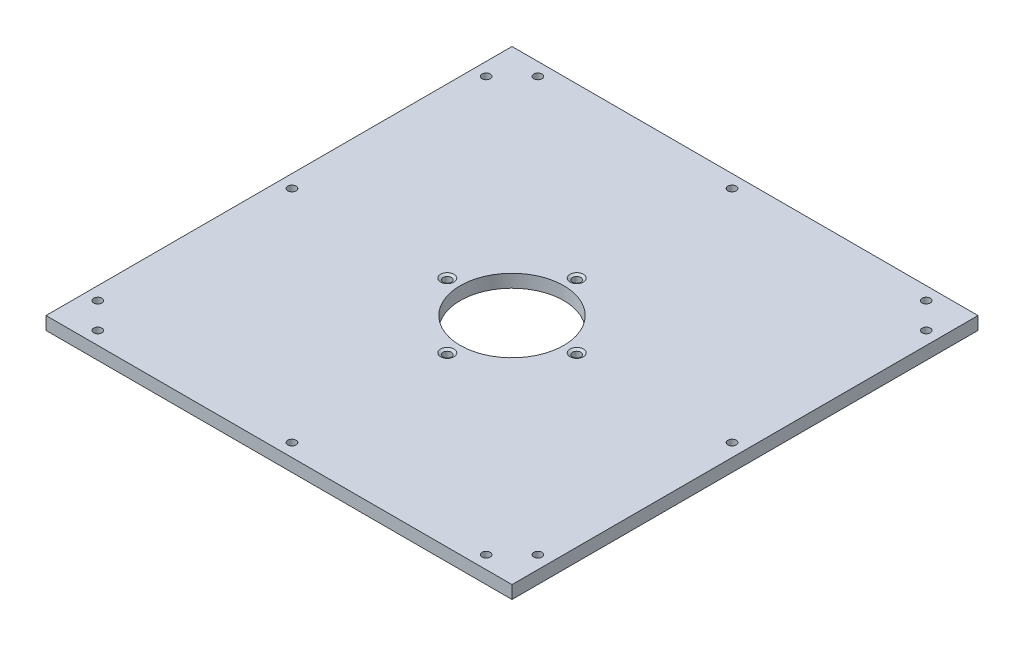
ISO-10303-21;
HEADER;
FILE_DESCRIPTION(('STEP AP214'),'2;1');
FILE_NAME('part.step','',(''),(''),'','','');
FILE_SCHEMA(('AUTOMOTIVE_DESIGN { 1 0 10303 214 1 1 1 1 }'));
ENDSEC;
DATA;
#1=APPLICATION_CONTEXT('core data for automotive mechanical design processes');
#2=APPLICATION_PROTOCOL_DEFINITION('international standard','automotive_design',2000,#1);
#3=PRODUCT_CONTEXT('',#1,'mechanical');
#4=PRODUCT('Part','Part','',(#3));
#5=PRODUCT_RELATED_PRODUCT_CATEGORY('part','',(#4));
#6=PRODUCT_DEFINITION_FORMATION('','',#4);
#7=PRODUCT_DEFINITION_CONTEXT('part definition',#1,'design');
#8=PRODUCT_DEFINITION('design','',#6,#7);
#9=PRODUCT_DEFINITION_SHAPE('','',#8);
#10=(LENGTH_UNIT() NAMED_UNIT(*) SI_UNIT(.MILLI.,.METRE.));
#11=(NAMED_UNIT(*) PLANE_ANGLE_UNIT() SI_UNIT($,.RADIAN.));
#12=(NAMED_UNIT(*) SI_UNIT($,.STERADIAN.) SOLID_ANGLE_UNIT());
#13=UNCERTAINTY_MEASURE_WITH_UNIT(LENGTH_MEASURE(1.E-05),#10,'distance_accuracy_value','');
#14=(GEOMETRIC_REPRESENTATION_CONTEXT(3) GLOBAL_UNCERTAINTY_ASSIGNED_CONTEXT((#13)) GLOBAL_UNIT_ASSIGNED_CONTEXT((#10,
#11,#12)) REPRESENTATION_CONTEXT('',''));
#15=CARTESIAN_POINT('',(0.,0.,0.));
#16=DIRECTION('',(0.,0.,1.));
#17=DIRECTION('',(1.,0.,0.));
#18=AXIS2_PLACEMENT_3D('',#15,#16,#17);
#19=CARTESIAN_POINT('',(0.,5.,0.));
#20=DIRECTION('',(0.,-1.,0.));
#21=DIRECTION('',(0.,0.,-1.));
#22=AXIS2_PLACEMENT_3D('',#19,#20,#21);
#23=PLANE('',#22);
#24=CARTESIAN_POINT('',(89.9999999999999,5.,-65.));
#25=DIRECTION('',(0.,-1.,0.));
#26=DIRECTION('',(0.,0.,-1.));
#27=AXIS2_PLACEMENT_3D('',#24,#25,#26);
#28=CIRCLE('',#27,2.60000000000007);
#29=CARTESIAN_POINT('',(89.9999999999999,5.,-67.6));
#30=VERTEX_POINT('',#29);
#31=EDGE_CURVE('E135',#30,#30,#28,.T.);
#32=ORIENTED_EDGE('',*,*,#31,.T.);
#33=EDGE_LOOP('',(#32));
#34=FACE_BOUND('',#33,.T.);
#35=CARTESIAN_POINT('',(115.,5.,-90.0000000000001));
#36=DIRECTION('',(0.,-1.,0.));
#37=DIRECTION('',(0.,0.,-1.));
#38=AXIS2_PLACEMENT_3D('',#35,#36,#37);
#39=CIRCLE('',#38,2.60000000000002);
#40=CARTESIAN_POINT('',(115.,5.,-92.6000000000001));
#41=VERTEX_POINT('',#40);
#42=EDGE_CURVE('E129',#41,#41,#39,.T.);
#43=ORIENTED_EDGE('',*,*,#42,.T.);
#44=EDGE_LOOP('',(#43));
#45=FACE_BOUND('',#44,.T.);
#46=CARTESIAN_POINT('',(64.9999999999999,5.,-90.));
#47=DIRECTION('',(0.,-1.,0.));
#48=DIRECTION('',(0.,0.,-1.));
#49=AXIS2_PLACEMENT_3D('',#46,#47,#48);
#50=CIRCLE('',#49,2.60000000000007);
#51=CARTESIAN_POINT('',(64.9999999999999,5.,-92.6));
#52=VERTEX_POINT('',#51);
#53=EDGE_CURVE('E127',#52,#52,#50,.T.);
#54=ORIENTED_EDGE('',*,*,#53,.T.);
#55=EDGE_LOOP('',(#54));
#56=FACE_BOUND('',#55,.T.);
#57=CARTESIAN_POINT('',(89.9999999999999,5.,-115.));
#58=DIRECTION('',(0.,-1.,0.));
#59=DIRECTION('',(0.,0.,-1.));
#60=AXIS2_PLACEMENT_3D('',#57,#58,#59);
#61=CIRCLE('',#60,2.60000000000007);
#62=CARTESIAN_POINT('',(89.9999999999999,5.,-117.6));
#63=VERTEX_POINT('',#62);
#64=EDGE_CURVE('E122',#63,#63,#61,.T.);
#65=ORIENTED_EDGE('',*,*,#64,.T.);
#66=EDGE_LOOP('',(#65));
#67=FACE_BOUND('',#66,.T.);
#68=DIRECTION('',(0.,0.,1.));
#69=VECTOR('',#68,1.);
#70=CARTESIAN_POINT('',(0.,5.,0.));
#71=LINE('',#70,#69);
#72=CARTESIAN_POINT('',(0.,5.,-180.));
#73=VERTEX_POINT('',#72);
#74=CARTESIAN_POINT('',(0.,5.,0.));
#75=VERTEX_POINT('',#74);
#76=EDGE_CURVE('E92',#73,#75,#71,.T.);
#77=ORIENTED_EDGE('',*,*,#76,.T.);
#78=DIRECTION('',(1.,0.,0.));
#79=VECTOR('',#78,1.);
#80=CARTESIAN_POINT('',(0.,5.,0.));
#81=LINE('',#80,#79);
#82=CARTESIAN_POINT('',(180.,5.,0.));
#83=VERTEX_POINT('',#82);
#84=EDGE_CURVE('E89',#75,#83,#81,.T.);
#85=ORIENTED_EDGE('',*,*,#84,.T.);
#86=DIRECTION('',(0.,0.,-1.));
#87=VECTOR('',#86,1.);
#88=CARTESIAN_POINT('',(180.,5.,0.));
#89=LINE('',#88,#87);
#90=CARTESIAN_POINT('',(180.,5.,-180.));
#91=VERTEX_POINT('',#90);
#92=EDGE_CURVE('E91',#83,#91,#89,.T.);
#93=ORIENTED_EDGE('',*,*,#92,.T.);
#94=DIRECTION('',(-1.,0.,0.));
#95=VECTOR('',#94,1.);
#96=CARTESIAN_POINT('',(0.,5.,-180.));
#97=LINE('',#96,#95);
#98=EDGE_CURVE('E56',#91,#73,#97,.T.);
#99=ORIENTED_EDGE('',*,*,#98,.T.);
#100=EDGE_LOOP('',(#77,#85,#93,#99));
#101=FACE_BOUND('',#100,.T.);
#102=CARTESIAN_POINT('',(89.9999999999999,5.,-90.));
#103=DIRECTION('',(0.,1.,0.));
#104=DIRECTION('',(0.,0.,1.));
#105=AXIS2_PLACEMENT_3D('',#102,#103,#104);
#106=CIRCLE('',#105,20.);
#107=CARTESIAN_POINT('',(89.9999999999999,5.,-70.));
#108=VERTEX_POINT('',#107);
#109=EDGE_CURVE('E114',#108,#108,#106,.T.);
#110=ORIENTED_EDGE('',*,*,#109,.F.);
#111=EDGE_LOOP('',(#110));
#112=FACE_BOUND('',#111,.T.);
#113=CARTESIAN_POINT('',(175.,5.,-15.0000000000001));
#114=DIRECTION('',(0.,1.,0.));
#115=DIRECTION('',(0.,0.,1.));
#116=AXIS2_PLACEMENT_3D('',#113,#114,#115);
#117=CIRCLE('',#116,1.59999999999999);
#118=CARTESIAN_POINT('',(175.,5.,-13.4000000000001));
#119=VERTEX_POINT('',#118);
#120=EDGE_CURVE('E288',#119,#119,#117,.T.);
#121=ORIENTED_EDGE('',*,*,#120,.F.);
#122=EDGE_LOOP('',(#121));
#123=FACE_BOUND('',#122,.T.);
#124=CARTESIAN_POINT('',(5.,5.,-165.));
#125=DIRECTION('',(0.,1.,0.));
#126=DIRECTION('',(0.,0.,1.));
#127=AXIS2_PLACEMENT_3D('',#124,#125,#126);
#128=CIRCLE('',#127,1.59999999999999);
#129=CARTESIAN_POINT('',(5.,5.,-163.4));
#130=VERTEX_POINT('',#129);
#131=EDGE_CURVE('E286',#130,#130,#128,.T.);
#132=ORIENTED_EDGE('',*,*,#131,.F.);
#133=EDGE_LOOP('',(#132));
#134=FACE_BOUND('',#133,.T.);
#135=CARTESIAN_POINT('',(5.00000000000002,5.,-90.));
#136=DIRECTION('',(0.,1.,0.));
#137=DIRECTION('',(0.,0.,1.));
#138=AXIS2_PLACEMENT_3D('',#135,#136,#137);
#139=CIRCLE('',#138,1.6);
#140=CARTESIAN_POINT('',(5.00000000000002,5.,-88.4));
#141=VERTEX_POINT('',#140);
#142=EDGE_CURVE('E281',#141,#141,#139,.T.);
#143=ORIENTED_EDGE('',*,*,#142,.F.);
#144=EDGE_LOOP('',(#143));
#145=FACE_BOUND('',#144,.T.);
#146=CARTESIAN_POINT('',(15.,5.,-175.));
#147=DIRECTION('',(0.,1.,0.));
#148=DIRECTION('',(0.,0.,1.));
#149=AXIS2_PLACEMENT_3D('',#146,#147,#148);
#150=CIRCLE('',#149,1.6);
#151=CARTESIAN_POINT('',(15.,5.,-173.4));
#152=VERTEX_POINT('',#151);
#153=EDGE_CURVE('E278',#152,#152,#150,.T.);
#154=ORIENTED_EDGE('',*,*,#153,.F.);
#155=EDGE_LOOP('',(#154));
#156=FACE_BOUND('',#155,.T.);
#157=CARTESIAN_POINT('',(5.,5.,-14.9999999999999));
#158=DIRECTION('',(0.,1.,0.));
#159=DIRECTION('',(0.,0.,-1.));
#160=AXIS2_PLACEMENT_3D('',#157,#158,#159);
#161=CIRCLE('',#160,1.59999999999999);
#162=CARTESIAN_POINT('',(5.,5.,-16.5999999999999));
#163=VERTEX_POINT('',#162);
#164=EDGE_CURVE('E280',#163,#163,#161,.T.);
#165=ORIENTED_EDGE('',*,*,#164,.F.);
#166=EDGE_LOOP('',(#165));
#167=FACE_BOUND('',#166,.T.);
#168=CARTESIAN_POINT('',(175.,5.,-90.0000000000001));
#169=DIRECTION('',(0.,1.,0.));
#170=DIRECTION('',(0.,0.,-1.));
#171=AXIS2_PLACEMENT_3D('',#168,#169,#170);
#172=CIRCLE('',#171,1.60000000000002);
#173=CARTESIAN_POINT('',(175.,5.,-91.6000000000002));
#174=VERTEX_POINT('',#173);
#175=EDGE_CURVE('E273',#174,#174,#172,.T.);
#176=ORIENTED_EDGE('',*,*,#175,.F.);
#177=EDGE_LOOP('',(#176));
#178=FACE_BOUND('',#177,.T.);
#179=CARTESIAN_POINT('',(175.,5.,-165.));
#180=DIRECTION('',(0.,1.,0.));
#181=DIRECTION('',(0.,0.,-1.));
#182=AXIS2_PLACEMENT_3D('',#179,#180,#181);
#183=CIRCLE('',#182,1.59999999999999);
#184=CARTESIAN_POINT('',(175.,5.,-166.6));
#185=VERTEX_POINT('',#184);
#186=EDGE_CURVE('E271',#185,#185,#183,.T.);
#187=ORIENTED_EDGE('',*,*,#186,.F.);
#188=EDGE_LOOP('',(#187));
#189=FACE_BOUND('',#188,.T.);
#190=CARTESIAN_POINT('',(89.9999999999999,5.,-175.));
#191=DIRECTION('',(0.,1.,0.));
#192=DIRECTION('',(0.,0.,1.));
#193=AXIS2_PLACEMENT_3D('',#190,#191,#192);
#194=CIRCLE('',#193,1.6);
#195=CARTESIAN_POINT('',(89.9999999999999,5.,-173.4));
#196=VERTEX_POINT('',#195);
#197=EDGE_CURVE('E268',#196,#196,#194,.T.);
#198=ORIENTED_EDGE('',*,*,#197,.F.);
#199=EDGE_LOOP('',(#198));
#200=FACE_BOUND('',#199,.T.);
#201=CARTESIAN_POINT('',(165.,5.,-175.));
#202=DIRECTION('',(0.,1.,0.));
#203=DIRECTION('',(0.,0.,-1.));
#204=AXIS2_PLACEMENT_3D('',#201,#202,#203);
#205=CIRCLE('',#204,1.59999999999999);
#206=CARTESIAN_POINT('',(165.,5.,-176.6));
#207=VERTEX_POINT('',#206);
#208=EDGE_CURVE('E264',#207,#207,#205,.T.);
#209=ORIENTED_EDGE('',*,*,#208,.F.);
#210=EDGE_LOOP('',(#209));
#211=FACE_BOUND('',#210,.T.);
#212=CARTESIAN_POINT('',(165.,5.,-4.99999999999984));
#213=DIRECTION('',(0.,1.,0.));
#214=DIRECTION('',(0.,0.,1.));
#215=AXIS2_PLACEMENT_3D('',#212,#213,#214);
#216=CIRCLE('',#215,1.59999999999999);
#217=CARTESIAN_POINT('',(165.,5.,-3.39999999999985));
#218=VERTEX_POINT('',#217);
#219=EDGE_CURVE('E265',#218,#218,#216,.T.);
#220=ORIENTED_EDGE('',*,*,#219,.F.);
#221=EDGE_LOOP('',(#220));
#222=FACE_BOUND('',#221,.T.);
#223=CARTESIAN_POINT('',(89.9999999999999,5.,-4.99999999999989));
#224=DIRECTION('',(0.,1.,0.));
#225=DIRECTION('',(0.,0.,-1.));
#226=AXIS2_PLACEMENT_3D('',#223,#224,#225);
#227=CIRCLE('',#226,1.6);
#228=CARTESIAN_POINT('',(89.9999999999999,5.,-6.5999999999999));
#229=VERTEX_POINT('',#228);
#230=EDGE_CURVE('E259',#229,#229,#227,.T.);
#231=ORIENTED_EDGE('',*,*,#230,.F.);
#232=EDGE_LOOP('',(#231));
#233=FACE_BOUND('',#232,.T.);
#234=CARTESIAN_POINT('',(15.,5.,-4.99999999999989));
#235=DIRECTION('',(0.,1.,0.));
#236=DIRECTION('',(0.,0.,-1.));
#237=AXIS2_PLACEMENT_3D('',#234,#235,#236);
#238=CIRCLE('',#237,1.59999999999999);
#239=CARTESIAN_POINT('',(15.,5.,-6.59999999999988));
#240=VERTEX_POINT('',#239);
#241=EDGE_CURVE('E258',#240,#240,#238,.T.);
#242=ORIENTED_EDGE('',*,*,#241,.F.);
#243=EDGE_LOOP('',(#242));
#244=FACE_BOUND('',#243,.T.);
#245=ADVANCED_FACE('F41',(#34,#45,#56,#67,#101,#112,#123,#134,#145,#156,#167,#178,#189,#200,
#211,#222,#233,#244),#23,.F.);
#246=CARTESIAN_POINT('',(0.,0.,0.));
#247=DIRECTION('',(0.,-1.,0.));
#248=DIRECTION('',(0.,0.,-1.));
#249=AXIS2_PLACEMENT_3D('',#246,#247,#248);
#250=PLANE('',#249);
#251=CARTESIAN_POINT('',(5.00000000000002,0.,-90.));
#252=DIRECTION('',(0.,-1.,0.));
#253=DIRECTION('',(0.,0.,-1.));
#254=AXIS2_PLACEMENT_3D('',#251,#252,#253);
#255=CIRCLE('',#254,2.17735026918966);
#256=CARTESIAN_POINT('',(5.00000000000002,0.,-92.1773502691897));
#257=VERTEX_POINT('',#256);
#258=EDGE_CURVE('E180',#257,#257,#255,.F.);
#259=ORIENTED_EDGE('',*,*,#258,.T.);
#260=EDGE_LOOP('',(#259));
#261=FACE_BOUND('',#260,.T.);
#262=CARTESIAN_POINT('',(5.,0.,-14.9999999999999));
#263=DIRECTION('',(0.,-1.,0.));
#264=DIRECTION('',(0.,0.,-1.));
#265=AXIS2_PLACEMENT_3D('',#262,#263,#264);
#266=CIRCLE('',#265,2.17735026918961);
#267=CARTESIAN_POINT('',(5.,0.,-17.1773502691895));
#268=VERTEX_POINT('',#267);
#269=EDGE_CURVE('E172',#268,#268,#266,.F.);
#270=ORIENTED_EDGE('',*,*,#269,.T.);
#271=EDGE_LOOP('',(#270));
#272=FACE_BOUND('',#271,.T.);
#273=CARTESIAN_POINT('',(15.,0.,-4.99999999999989));
#274=DIRECTION('',(0.,-1.,0.));
#275=DIRECTION('',(0.,0.,-1.));
#276=AXIS2_PLACEMENT_3D('',#273,#274,#275);
#277=CIRCLE('',#276,2.17735026918966);
#278=CARTESIAN_POINT('',(15.,0.,-7.17735026918956));
#279=VERTEX_POINT('',#278);
#280=EDGE_CURVE('E173',#279,#279,#277,.F.);
#281=ORIENTED_EDGE('',*,*,#280,.T.);
#282=EDGE_LOOP('',(#281));
#283=FACE_BOUND('',#282,.T.);
#284=CARTESIAN_POINT('',(89.9999999999999,0.,-4.99999999999989));
#285=DIRECTION('',(0.,-1.,0.));
#286=DIRECTION('',(0.,0.,-1.));
#287=AXIS2_PLACEMENT_3D('',#284,#285,#286);
#288=CIRCLE('',#287,2.17735026918961);
#289=CARTESIAN_POINT('',(89.9999999999999,0.,-7.1773502691895));
#290=VERTEX_POINT('',#289);
#291=EDGE_CURVE('E169',#290,#290,#288,.F.);
#292=ORIENTED_EDGE('',*,*,#291,.T.);
#293=EDGE_LOOP('',(#292));
#294=FACE_BOUND('',#293,.T.);
#295=CARTESIAN_POINT('',(165.,0.,-4.99999999999984));
#296=DIRECTION('',(0.,-1.,0.));
#297=DIRECTION('',(0.,0.,-1.));
#298=AXIS2_PLACEMENT_3D('',#295,#296,#297);
#299=CIRCLE('',#298,2.17735026918966);
#300=CARTESIAN_POINT('',(165.,0.,-7.1773502691895));
#301=VERTEX_POINT('',#300);
#302=EDGE_CURVE('E164',#301,#301,#299,.F.);
#303=ORIENTED_EDGE('',*,*,#302,.T.);
#304=EDGE_LOOP('',(#303));
#305=FACE_BOUND('',#304,.T.);
#306=CARTESIAN_POINT('',(175.,0.,-15.0000000000001));
#307=DIRECTION('',(0.,-1.,0.));
#308=DIRECTION('',(0.,0.,-1.));
#309=AXIS2_PLACEMENT_3D('',#306,#307,#308);
#310=CIRCLE('',#309,2.17735026918966);
#311=CARTESIAN_POINT('',(175.,0.,-17.1773502691897));
#312=VERTEX_POINT('',#311);
#313=EDGE_CURVE('E165',#312,#312,#310,.F.);
#314=ORIENTED_EDGE('',*,*,#313,.T.);
#315=EDGE_LOOP('',(#314));
#316=FACE_BOUND('',#315,.T.);
#317=CARTESIAN_POINT('',(175.,0.,-90.0000000000001));
#318=DIRECTION('',(0.,-1.,0.));
#319=DIRECTION('',(0.,0.,-1.));
#320=AXIS2_PLACEMENT_3D('',#317,#318,#319);
#321=CIRCLE('',#320,2.17735026918961);
#322=CARTESIAN_POINT('',(175.,0.,-92.1773502691897));
#323=VERTEX_POINT('',#322);
#324=EDGE_CURVE('E157',#323,#323,#321,.F.);
#325=ORIENTED_EDGE('',*,*,#324,.T.);
#326=EDGE_LOOP('',(#325));
#327=FACE_BOUND('',#326,.T.);
#328=CARTESIAN_POINT('',(5.,0.,-165.));
#329=DIRECTION('',(0.,-1.,0.));
#330=DIRECTION('',(0.,0.,-1.));
#331=AXIS2_PLACEMENT_3D('',#328,#329,#330);
#332=CIRCLE('',#331,2.17735026918966);
#333=CARTESIAN_POINT('',(5.,0.,-167.17735026919));
#334=VERTEX_POINT('',#333);
#335=EDGE_CURVE('E156',#334,#334,#332,.F.);
#336=ORIENTED_EDGE('',*,*,#335,.T.);
#337=EDGE_LOOP('',(#336));
#338=FACE_BOUND('',#337,.T.);
#339=CARTESIAN_POINT('',(15.,0.,-175.));
#340=DIRECTION('',(0.,-1.,0.));
#341=DIRECTION('',(0.,0.,-1.));
#342=AXIS2_PLACEMENT_3D('',#339,#340,#341);
#343=CIRCLE('',#342,2.17735026918966);
#344=CARTESIAN_POINT('',(15.,0.,-177.17735026919));
#345=VERTEX_POINT('',#344);
#346=EDGE_CURVE('E153',#345,#345,#343,.F.);
#347=ORIENTED_EDGE('',*,*,#346,.T.);
#348=EDGE_LOOP('',(#347));
#349=FACE_BOUND('',#348,.T.);
#350=CARTESIAN_POINT('',(89.9999999999999,0.,-175.));
#351=DIRECTION('',(0.,-1.,0.));
#352=DIRECTION('',(0.,0.,-1.));
#353=AXIS2_PLACEMENT_3D('',#350,#351,#352);
#354=CIRCLE('',#353,2.17735026918966);
#355=CARTESIAN_POINT('',(89.9999999999999,0.,-177.17735026919));
#356=VERTEX_POINT('',#355);
#357=EDGE_CURVE('E147',#356,#356,#354,.F.);
#358=ORIENTED_EDGE('',*,*,#357,.T.);
#359=EDGE_LOOP('',(#358));
#360=FACE_BOUND('',#359,.T.);
#361=CARTESIAN_POINT('',(165.,0.,-175.));
#362=DIRECTION('',(0.,-1.,0.));
#363=DIRECTION('',(0.,0.,-1.));
#364=AXIS2_PLACEMENT_3D('',#361,#362,#363);
#365=CIRCLE('',#364,2.17735026918961);
#366=CARTESIAN_POINT('',(165.,0.,-177.17735026919));
#367=VERTEX_POINT('',#366);
#368=EDGE_CURVE('E150',#367,#367,#365,.F.);
#369=ORIENTED_EDGE('',*,*,#368,.T.);
#370=EDGE_LOOP('',(#369));
#371=FACE_BOUND('',#370,.T.);
#372=CARTESIAN_POINT('',(175.,0.,-165.));
#373=DIRECTION('',(0.,-1.,0.));
#374=DIRECTION('',(0.,0.,-1.));
#375=AXIS2_PLACEMENT_3D('',#372,#373,#374);
#376=CIRCLE('',#375,2.17735026918961);
#377=CARTESIAN_POINT('',(175.,0.,-167.17735026919));
#378=VERTEX_POINT('',#377);
#379=EDGE_CURVE('E145',#378,#378,#376,.F.);
#380=ORIENTED_EDGE('',*,*,#379,.T.);
#381=EDGE_LOOP('',(#380));
#382=FACE_BOUND('',#381,.T.);
#383=CARTESIAN_POINT('',(64.9999999999999,0.,-90.));
#384=DIRECTION('',(0.,1.,0.));
#385=DIRECTION('',(0.,0.,1.));
#386=AXIS2_PLACEMENT_3D('',#383,#384,#385);
#387=CIRCLE('',#386,1.60000000000001);
#388=CARTESIAN_POINT('',(64.9999999999999,0.,-88.4));
#389=VERTEX_POINT('',#388);
#390=EDGE_CURVE('E235',#389,#389,#387,.T.);
#391=ORIENTED_EDGE('',*,*,#390,.T.);
#392=EDGE_LOOP('',(#391));
#393=FACE_BOUND('',#392,.T.);
#394=CARTESIAN_POINT('',(89.9999999999999,0.,-115.));
#395=DIRECTION('',(0.,1.,0.));
#396=DIRECTION('',(0.,0.,1.));
#397=AXIS2_PLACEMENT_3D('',#394,#395,#396);
#398=CIRCLE('',#397,1.60000000000001);
#399=CARTESIAN_POINT('',(89.9999999999999,0.,-113.4));
#400=VERTEX_POINT('',#399);
#401=EDGE_CURVE('E237',#400,#400,#398,.T.);
#402=ORIENTED_EDGE('',*,*,#401,.T.);
#403=EDGE_LOOP('',(#402));
#404=FACE_BOUND('',#403,.T.);
#405=DIRECTION('',(0.,0.,1.));
#406=VECTOR('',#405,1.);
#407=CARTESIAN_POINT('',(0.,0.,0.));
#408=LINE('',#407,#406);
#409=CARTESIAN_POINT('',(0.,0.,-180.));
#410=VERTEX_POINT('',#409);
#411=CARTESIAN_POINT('',(0.,0.,0.));
#412=VERTEX_POINT('',#411);
#413=EDGE_CURVE('E109',#410,#412,#408,.T.);
#414=ORIENTED_EDGE('',*,*,#413,.F.);
#415=DIRECTION('',(-1.,0.,0.));
#416=VECTOR('',#415,1.);
#417=CARTESIAN_POINT('',(0.,0.,-180.));
#418=LINE('',#417,#416);
#419=CARTESIAN_POINT('',(180.,0.,-180.));
#420=VERTEX_POINT('',#419);
#421=EDGE_CURVE('E85',#420,#410,#418,.T.);
#422=ORIENTED_EDGE('',*,*,#421,.F.);
#423=DIRECTION('',(0.,0.,-1.));
#424=VECTOR('',#423,1.);
#425=CARTESIAN_POINT('',(180.,0.,0.));
#426=LINE('',#425,#424);
#427=CARTESIAN_POINT('',(180.,0.,0.));
#428=VERTEX_POINT('',#427);
#429=EDGE_CURVE('E78',#428,#420,#426,.T.);
#430=ORIENTED_EDGE('',*,*,#429,.F.);
#431=DIRECTION('',(1.,0.,0.));
#432=VECTOR('',#431,1.);
#433=CARTESIAN_POINT('',(0.,0.,0.));
#434=LINE('',#433,#432);
#435=EDGE_CURVE('E99',#412,#428,#434,.T.);
#436=ORIENTED_EDGE('',*,*,#435,.F.);
#437=EDGE_LOOP('',(#414,#422,#430,#436));
#438=FACE_BOUND('',#437,.T.);
#439=CARTESIAN_POINT('',(89.9999999999999,0.,-90.));
#440=DIRECTION('',(0.,1.,0.));
#441=DIRECTION('',(0.,0.,1.));
#442=AXIS2_PLACEMENT_3D('',#439,#440,#441);
#443=CIRCLE('',#442,20.);
#444=CARTESIAN_POINT('',(89.9999999999999,0.,-70.));
#445=VERTEX_POINT('',#444);
#446=EDGE_CURVE('E245',#445,#445,#443,.T.);
#447=ORIENTED_EDGE('',*,*,#446,.T.);
#448=EDGE_LOOP('',(#447));
#449=FACE_BOUND('',#448,.T.);
#450=CARTESIAN_POINT('',(89.9999999999999,0.,-65.));
#451=DIRECTION('',(0.,1.,0.));
#452=DIRECTION('',(0.,0.,-1.));
#453=AXIS2_PLACEMENT_3D('',#450,#451,#452);
#454=CIRCLE('',#453,1.60000000000001);
#455=CARTESIAN_POINT('',(89.9999999999999,0.,-66.6));
#456=VERTEX_POINT('',#455);
#457=EDGE_CURVE('E246',#456,#456,#454,.T.);
#458=ORIENTED_EDGE('',*,*,#457,.T.);
#459=EDGE_LOOP('',(#458));
#460=FACE_BOUND('',#459,.T.);
#461=CARTESIAN_POINT('',(115.,0.,-90.0000000000001));
#462=DIRECTION('',(0.,1.,0.));
#463=DIRECTION('',(0.,0.,-1.));
#464=AXIS2_PLACEMENT_3D('',#461,#462,#463);
#465=CIRCLE('',#464,1.60000000000001);
#466=CARTESIAN_POINT('',(115.,0.,-91.6000000000001));
#467=VERTEX_POINT('',#466);
#468=EDGE_CURVE('E248',#467,#467,#465,.T.);
#469=ORIENTED_EDGE('',*,*,#468,.T.);
#470=EDGE_LOOP('',(#469));
#471=FACE_BOUND('',#470,.T.);
#472=ADVANCED_FACE('F222',(#261,#272,#283,#294,#305,#316,#327,#338,#349,#360,#371,#382,#393,
#404,#438,#449,#460,#471),#250,.T.);
#473=CARTESIAN_POINT('',(0.,5.,0.));
#474=DIRECTION('',(1.,0.,0.));
#475=DIRECTION('',(0.,0.,-1.));
#476=AXIS2_PLACEMENT_3D('',#473,#474,#475);
#477=PLANE('',#476);
#478=ORIENTED_EDGE('',*,*,#413,.T.);
#479=DIRECTION('',(0.,-1.,0.));
#480=VECTOR('',#479,1.);
#481=CARTESIAN_POINT('',(0.,5.,0.));
#482=LINE('',#481,#480);
#483=EDGE_CURVE('E101',#75,#412,#482,.T.);
#484=ORIENTED_EDGE('',*,*,#483,.F.);
#485=ORIENTED_EDGE('',*,*,#76,.F.);
#486=DIRECTION('',(0.,-1.,0.));
#487=VECTOR('',#486,1.);
#488=CARTESIAN_POINT('',(0.,5.,-180.));
#489=LINE('',#488,#487);
#490=EDGE_CURVE('E106',#73,#410,#489,.T.);
#491=ORIENTED_EDGE('',*,*,#490,.T.);
#492=EDGE_LOOP('',(#478,#484,#485,#491));
#493=FACE_BOUND('',#492,.T.);
#494=ADVANCED_FACE('F221',(#493),#477,.F.);
#495=CARTESIAN_POINT('',(0.,5.,0.));
#496=DIRECTION('',(0.,0.,-1.));
#497=DIRECTION('',(-1.,0.,0.));
#498=AXIS2_PLACEMENT_3D('',#495,#496,#497);
#499=PLANE('',#498);
#500=ORIENTED_EDGE('',*,*,#435,.T.);
#501=DIRECTION('',(0.,-1.,0.));
#502=VECTOR('',#501,1.);
#503=CARTESIAN_POINT('',(180.,5.,0.));
#504=LINE('',#503,#502);
#505=EDGE_CURVE('E98',#83,#428,#504,.T.);
#506=ORIENTED_EDGE('',*,*,#505,.F.);
#507=ORIENTED_EDGE('',*,*,#84,.F.);
#508=ORIENTED_EDGE('',*,*,#483,.T.);
#509=EDGE_LOOP('',(#500,#506,#507,#508));
#510=FACE_BOUND('',#509,.T.);
#511=ADVANCED_FACE('F97',(#510),#499,.F.);
#512=CARTESIAN_POINT('',(180.,5.,0.));
#513=DIRECTION('',(-1.,0.,0.));
#514=DIRECTION('',(0.,0.,1.));
#515=AXIS2_PLACEMENT_3D('',#512,#513,#514);
#516=PLANE('',#515);
#517=ORIENTED_EDGE('',*,*,#429,.T.);
#518=DIRECTION('',(0.,-1.,0.));
#519=VECTOR('',#518,1.);
#520=CARTESIAN_POINT('',(180.,5.,-180.));
#521=LINE('',#520,#519);
#522=EDGE_CURVE('E105',#91,#420,#521,.T.);
#523=ORIENTED_EDGE('',*,*,#522,.F.);
#524=ORIENTED_EDGE('',*,*,#92,.F.);
#525=ORIENTED_EDGE('',*,*,#505,.T.);
#526=EDGE_LOOP('',(#517,#523,#524,#525));
#527=FACE_BOUND('',#526,.T.);
#528=ADVANCED_FACE('F102',(#527),#516,.F.);
#529=CARTESIAN_POINT('',(0.,5.,-180.));
#530=DIRECTION('',(0.,0.,1.));
#531=DIRECTION('',(1.,0.,0.));
#532=AXIS2_PLACEMENT_3D('',#529,#530,#531);
#533=PLANE('',#532);
#534=ORIENTED_EDGE('',*,*,#421,.T.);
#535=ORIENTED_EDGE('',*,*,#490,.F.);
#536=ORIENTED_EDGE('',*,*,#98,.F.);
#537=ORIENTED_EDGE('',*,*,#522,.T.);
#538=EDGE_LOOP('',(#534,#535,#536,#537));
#539=FACE_BOUND('',#538,.T.);
#540=ADVANCED_FACE('F382',(#539),#533,.F.);
#541=CARTESIAN_POINT('',(89.9999999999999,5.,-90.));
#542=DIRECTION('',(0.,-1.,0.));
#543=DIRECTION('',(0.,0.,-1.));
#544=AXIS2_PLACEMENT_3D('',#541,#542,#543);
#545=CYLINDRICAL_SURFACE('',#544,20.);
#546=ORIENTED_EDGE('',*,*,#109,.T.);
#547=EDGE_LOOP('',(#546));
#548=FACE_BOUND('',#547,.T.);
#549=ORIENTED_EDGE('',*,*,#446,.F.);
#550=EDGE_LOOP('',(#549));
#551=FACE_BOUND('',#550,.T.);
#552=ADVANCED_FACE('F298',(#548,#551),#545,.F.);
#553=CARTESIAN_POINT('',(175.,5.,-15.0000000000001));
#554=DIRECTION('',(0.,-1.,0.));
#555=DIRECTION('',(0.,0.,-1.));
#556=AXIS2_PLACEMENT_3D('',#553,#554,#555);
#557=CYLINDRICAL_SURFACE('',#556,1.59999999999999);
#558=CARTESIAN_POINT('',(175.,1.0000000000001,-15.0000000000001));
#559=DIRECTION('',(0.,-1.,0.));
#560=DIRECTION('',(0.,0.,-1.));
#561=AXIS2_PLACEMENT_3D('',#558,#559,#560);
#562=CIRCLE('',#561,1.59999999999999);
#563=CARTESIAN_POINT('',(175.,1.0000000000001,-16.6000000000001));
#564=VERTEX_POINT('',#563);
#565=EDGE_CURVE('E194',#564,#564,#562,.T.);
#566=ORIENTED_EDGE('',*,*,#565,.T.);
#567=EDGE_LOOP('',(#566));
#568=FACE_BOUND('',#567,.T.);
#569=ORIENTED_EDGE('',*,*,#120,.T.);
#570=EDGE_LOOP('',(#569));
#571=FACE_BOUND('',#570,.T.);
#572=ADVANCED_FACE('F380',(#568,#571),#557,.F.);
#573=CARTESIAN_POINT('',(5.,5.,-165.));
#574=DIRECTION('',(0.,-1.,0.));
#575=DIRECTION('',(0.,0.,-1.));
#576=AXIS2_PLACEMENT_3D('',#573,#574,#575);
#577=CYLINDRICAL_SURFACE('',#576,1.59999999999999);
#578=CARTESIAN_POINT('',(5.,1.00000000000009,-165.));
#579=DIRECTION('',(0.,-1.,0.));
#580=DIRECTION('',(0.,0.,-1.));
#581=AXIS2_PLACEMENT_3D('',#578,#579,#580);
#582=CIRCLE('',#581,1.59999999999999);
#583=CARTESIAN_POINT('',(5.,1.00000000000009,-166.6));
#584=VERTEX_POINT('',#583);
#585=EDGE_CURVE('E203',#584,#584,#582,.T.);
#586=ORIENTED_EDGE('',*,*,#585,.T.);
#587=EDGE_LOOP('',(#586));
#588=FACE_BOUND('',#587,.T.);
#589=ORIENTED_EDGE('',*,*,#131,.T.);
#590=EDGE_LOOP('',(#589));
#591=FACE_BOUND('',#590,.T.);
#592=ADVANCED_FACE('F373',(#588,#591),#577,.F.);
#593=CARTESIAN_POINT('',(5.00000000000002,5.,-90.));
#594=DIRECTION('',(0.,-1.,0.));
#595=DIRECTION('',(0.,0.,-1.));
#596=AXIS2_PLACEMENT_3D('',#593,#594,#595);
#597=CYLINDRICAL_SURFACE('',#596,1.6);
#598=CARTESIAN_POINT('',(5.00000000000002,1.00000000000007,-90.));
#599=DIRECTION('',(0.,-1.,0.));
#600=DIRECTION('',(0.,0.,-1.));
#601=AXIS2_PLACEMENT_3D('',#598,#599,#600);
#602=CIRCLE('',#601,1.6);
#603=CARTESIAN_POINT('',(5.00000000000002,1.00000000000007,-91.6));
#604=VERTEX_POINT('',#603);
#605=EDGE_CURVE('E179',#604,#604,#602,.T.);
#606=ORIENTED_EDGE('',*,*,#605,.T.);
#607=EDGE_LOOP('',(#606));
#608=FACE_BOUND('',#607,.T.);
#609=ORIENTED_EDGE('',*,*,#142,.T.);
#610=EDGE_LOOP('',(#609));
#611=FACE_BOUND('',#610,.T.);
#612=ADVANCED_FACE('F369',(#608,#611),#597,.F.);
#613=CARTESIAN_POINT('',(15.,5.,-175.));
#614=DIRECTION('',(0.,-1.,0.));
#615=DIRECTION('',(0.,0.,-1.));
#616=AXIS2_PLACEMENT_3D('',#613,#614,#615);
#617=CYLINDRICAL_SURFACE('',#616,1.6);
#618=CARTESIAN_POINT('',(15.,1.00000000000008,-175.));
#619=DIRECTION('',(0.,-1.,0.));
#620=DIRECTION('',(0.,0.,-1.));
#621=AXIS2_PLACEMENT_3D('',#618,#619,#620);
#622=CIRCLE('',#621,1.6);
#623=CARTESIAN_POINT('',(15.,1.00000000000008,-176.6));
#624=VERTEX_POINT('',#623);
#625=EDGE_CURVE('E204',#624,#624,#622,.T.);
#626=ORIENTED_EDGE('',*,*,#625,.T.);
#627=EDGE_LOOP('',(#626));
#628=FACE_BOUND('',#627,.T.);
#629=ORIENTED_EDGE('',*,*,#153,.T.);
#630=EDGE_LOOP('',(#629));
#631=FACE_BOUND('',#630,.T.);
#632=ADVANCED_FACE('F364',(#628,#631),#617,.F.);
#633=CARTESIAN_POINT('',(5.,5.,-14.9999999999999));
#634=DIRECTION('',(0.,-1.,0.));
#635=DIRECTION('',(0.,0.,-1.));
#636=AXIS2_PLACEMENT_3D('',#633,#634,#635);
#637=CYLINDRICAL_SURFACE('',#636,1.59999999999999);
#638=CARTESIAN_POINT('',(5.,0.999999999999981,-14.9999999999999));
#639=DIRECTION('',(0.,-1.,0.));
#640=DIRECTION('',(0.,0.,-1.));
#641=AXIS2_PLACEMENT_3D('',#638,#639,#640);
#642=CIRCLE('',#641,1.59999999999999);
#643=CARTESIAN_POINT('',(5.,0.999999999999981,-16.5999999999999));
#644=VERTEX_POINT('',#643);
#645=EDGE_CURVE('E181',#644,#644,#642,.T.);
#646=ORIENTED_EDGE('',*,*,#645,.T.);
#647=EDGE_LOOP('',(#646));
#648=FACE_BOUND('',#647,.T.);
#649=ORIENTED_EDGE('',*,*,#164,.T.);
#650=EDGE_LOOP('',(#649));
#651=FACE_BOUND('',#650,.T.);
#652=ADVANCED_FACE('F363',(#648,#651),#637,.F.);
#653=CARTESIAN_POINT('',(175.,5.,-90.0000000000001));
#654=DIRECTION('',(0.,-1.,0.));
#655=DIRECTION('',(0.,0.,-1.));
#656=AXIS2_PLACEMENT_3D('',#653,#654,#655);
#657=CYLINDRICAL_SURFACE('',#656,1.60000000000002);
#658=CARTESIAN_POINT('',(175.,0.999999999999926,-90.0000000000001));
#659=DIRECTION('',(0.,-1.,0.));
#660=DIRECTION('',(0.,0.,-1.));
#661=AXIS2_PLACEMENT_3D('',#658,#659,#660);
#662=CIRCLE('',#661,1.60000000000002);
#663=CARTESIAN_POINT('',(175.,0.999999999999926,-91.6000000000002));
#664=VERTEX_POINT('',#663);
#665=EDGE_CURVE('E196',#664,#664,#662,.T.);
#666=ORIENTED_EDGE('',*,*,#665,.T.);
#667=EDGE_LOOP('',(#666));
#668=FACE_BOUND('',#667,.T.);
#669=ORIENTED_EDGE('',*,*,#175,.T.);
#670=EDGE_LOOP('',(#669));
#671=FACE_BOUND('',#670,.T.);
#672=ADVANCED_FACE('F360',(#668,#671),#657,.F.);
#673=CARTESIAN_POINT('',(175.,5.,-165.));
#674=DIRECTION('',(0.,-1.,0.));
#675=DIRECTION('',(0.,0.,-1.));
#676=AXIS2_PLACEMENT_3D('',#673,#674,#675);
#677=CYLINDRICAL_SURFACE('',#676,1.59999999999999);
#678=CARTESIAN_POINT('',(175.,0.999999999999979,-165.));
#679=DIRECTION('',(0.,-1.,0.));
#680=DIRECTION('',(0.,0.,-1.));
#681=AXIS2_PLACEMENT_3D('',#678,#679,#680);
#682=CIRCLE('',#681,1.59999999999999);
#683=CARTESIAN_POINT('',(175.,0.999999999999979,-166.6));
#684=VERTEX_POINT('',#683);
#685=EDGE_CURVE('E11',#684,#684,#682,.T.);
#686=ORIENTED_EDGE('',*,*,#685,.T.);
#687=EDGE_LOOP('',(#686));
#688=FACE_BOUND('',#687,.T.);
#689=ORIENTED_EDGE('',*,*,#186,.T.);
#690=EDGE_LOOP('',(#689));
#691=FACE_BOUND('',#690,.T.);
#692=ADVANCED_FACE('F351',(#688,#691),#677,.F.);
#693=CARTESIAN_POINT('',(89.9999999999999,5.,-175.));
#694=DIRECTION('',(0.,-1.,0.));
#695=DIRECTION('',(0.,0.,-1.));
#696=AXIS2_PLACEMENT_3D('',#693,#694,#695);
#697=CYLINDRICAL_SURFACE('',#696,1.6);
#698=CARTESIAN_POINT('',(89.9999999999999,1.00000000000007,-175.));
#699=DIRECTION('',(0.,-1.,0.));
#700=DIRECTION('',(0.,0.,-1.));
#701=AXIS2_PLACEMENT_3D('',#698,#699,#700);
#702=CIRCLE('',#701,1.6);
#703=CARTESIAN_POINT('',(89.9999999999999,1.00000000000007,-176.6));
#704=VERTEX_POINT('',#703);
#705=EDGE_CURVE('E210',#704,#704,#702,.T.);
#706=ORIENTED_EDGE('',*,*,#705,.T.);
#707=EDGE_LOOP('',(#706));
#708=FACE_BOUND('',#707,.T.);
#709=ORIENTED_EDGE('',*,*,#197,.T.);
#710=EDGE_LOOP('',(#709));
#711=FACE_BOUND('',#710,.T.);
#712=ADVANCED_FACE('F348',(#708,#711),#697,.F.);
#713=CARTESIAN_POINT('',(165.,5.,-175.));
#714=DIRECTION('',(0.,-1.,0.));
#715=DIRECTION('',(0.,0.,-1.));
#716=AXIS2_PLACEMENT_3D('',#713,#714,#715);
#717=CYLINDRICAL_SURFACE('',#716,1.59999999999999);
#718=CARTESIAN_POINT('',(165.,0.999999999999979,-175.));
#719=DIRECTION('',(0.,-1.,0.));
#720=DIRECTION('',(0.,0.,-1.));
#721=AXIS2_PLACEMENT_3D('',#718,#719,#720);
#722=CIRCLE('',#721,1.59999999999999);
#723=CARTESIAN_POINT('',(165.,0.999999999999979,-176.6));
#724=VERTEX_POINT('',#723);
#725=EDGE_CURVE('E51',#724,#724,#722,.T.);
#726=ORIENTED_EDGE('',*,*,#725,.T.);
#727=EDGE_LOOP('',(#726));
#728=FACE_BOUND('',#727,.T.);
#729=ORIENTED_EDGE('',*,*,#208,.T.);
#730=EDGE_LOOP('',(#729));
#731=FACE_BOUND('',#730,.T.);
#732=ADVANCED_FACE('F215',(#728,#731),#717,.F.);
#733=CARTESIAN_POINT('',(165.,5.,-4.99999999999984));
#734=DIRECTION('',(0.,-1.,0.));
#735=DIRECTION('',(0.,0.,-1.));
#736=AXIS2_PLACEMENT_3D('',#733,#734,#735);
#737=CYLINDRICAL_SURFACE('',#736,1.59999999999999);
#738=CARTESIAN_POINT('',(165.,1.0000000000001,-4.99999999999984));
#739=DIRECTION('',(0.,-1.,0.));
#740=DIRECTION('',(0.,0.,-1.));
#741=AXIS2_PLACEMENT_3D('',#738,#739,#740);
#742=CIRCLE('',#741,1.59999999999999);
#743=CARTESIAN_POINT('',(165.,1.0000000000001,-6.59999999999983));
#744=VERTEX_POINT('',#743);
#745=EDGE_CURVE('E195',#744,#744,#742,.T.);
#746=ORIENTED_EDGE('',*,*,#745,.T.);
#747=EDGE_LOOP('',(#746));
#748=FACE_BOUND('',#747,.T.);
#749=ORIENTED_EDGE('',*,*,#219,.T.);
#750=EDGE_LOOP('',(#749));
#751=FACE_BOUND('',#750,.T.);
#752=ADVANCED_FACE('F339',(#748,#751),#737,.F.);
#753=CARTESIAN_POINT('',(89.9999999999999,5.,-4.99999999999989));
#754=DIRECTION('',(0.,-1.,0.));
#755=DIRECTION('',(0.,0.,-1.));
#756=AXIS2_PLACEMENT_3D('',#753,#754,#755);
#757=CYLINDRICAL_SURFACE('',#756,1.6);
#758=CARTESIAN_POINT('',(89.9999999999999,0.999999999999963,-4.99999999999989));
#759=DIRECTION('',(0.,-1.,0.));
#760=DIRECTION('',(0.,0.,-1.));
#761=AXIS2_PLACEMENT_3D('',#758,#759,#760);
#762=CIRCLE('',#761,1.6);
#763=CARTESIAN_POINT('',(89.9999999999999,0.999999999999963,-6.5999999999999));
#764=VERTEX_POINT('',#763);
#765=EDGE_CURVE('E187',#764,#764,#762,.T.);
#766=ORIENTED_EDGE('',*,*,#765,.T.);
#767=EDGE_LOOP('',(#766));
#768=FACE_BOUND('',#767,.T.);
#769=ORIENTED_EDGE('',*,*,#230,.T.);
#770=EDGE_LOOP('',(#769));
#771=FACE_BOUND('',#770,.T.);
#772=ADVANCED_FACE('F328',(#768,#771),#757,.F.);
#773=CARTESIAN_POINT('',(15.,5.,-4.99999999999989));
#774=DIRECTION('',(0.,-1.,0.));
#775=DIRECTION('',(0.,0.,-1.));
#776=AXIS2_PLACEMENT_3D('',#773,#774,#775);
#777=CYLINDRICAL_SURFACE('',#776,1.59999999999999);
#778=CARTESIAN_POINT('',(15.,1.0000000000001,-4.99999999999989));
#779=DIRECTION('',(0.,-1.,0.));
#780=DIRECTION('',(0.,0.,-1.));
#781=AXIS2_PLACEMENT_3D('',#778,#779,#780);
#782=CIRCLE('',#781,1.59999999999999);
#783=CARTESIAN_POINT('',(15.,1.0000000000001,-6.59999999999988));
#784=VERTEX_POINT('',#783);
#785=EDGE_CURVE('E188',#784,#784,#782,.T.);
#786=ORIENTED_EDGE('',*,*,#785,.T.);
#787=EDGE_LOOP('',(#786));
#788=FACE_BOUND('',#787,.T.);
#789=ORIENTED_EDGE('',*,*,#241,.T.);
#790=EDGE_LOOP('',(#789));
#791=FACE_BOUND('',#790,.T.);
#792=ADVANCED_FACE('F326',(#788,#791),#777,.F.);
#793=CARTESIAN_POINT('',(89.9999999999999,5.,-115.));
#794=DIRECTION('',(0.,-1.,0.));
#795=DIRECTION('',(0.,0.,-1.));
#796=AXIS2_PLACEMENT_3D('',#793,#794,#795);
#797=CYLINDRICAL_SURFACE('',#796,1.60000000000001);
#798=CARTESIAN_POINT('',(89.9999999999999,4.42264973081037,-115.));
#799=DIRECTION('',(0.,-1.,0.));
#800=DIRECTION('',(0.,0.,-1.));
#801=AXIS2_PLACEMENT_3D('',#798,#799,#800);
#802=CIRCLE('',#801,1.60000000000001);
#803=CARTESIAN_POINT('',(89.9999999999999,4.42264973081037,-116.6));
#804=VERTEX_POINT('',#803);
#805=EDGE_CURVE('E143',#804,#804,#802,.F.);
#806=ORIENTED_EDGE('',*,*,#805,.T.);
#807=EDGE_LOOP('',(#806));
#808=FACE_BOUND('',#807,.T.);
#809=ORIENTED_EDGE('',*,*,#401,.F.);
#810=EDGE_LOOP('',(#809));
#811=FACE_BOUND('',#810,.T.);
#812=ADVANCED_FACE('F327',(#808,#811),#797,.F.);
#813=CARTESIAN_POINT('',(89.9999999999999,5.,-65.));
#814=DIRECTION('',(0.,-1.,0.));
#815=DIRECTION('',(0.,0.,-1.));
#816=AXIS2_PLACEMENT_3D('',#813,#814,#815);
#817=CYLINDRICAL_SURFACE('',#816,1.60000000000001);
#818=CARTESIAN_POINT('',(89.9999999999999,4.42264973081037,-65.));
#819=DIRECTION('',(0.,-1.,0.));
#820=DIRECTION('',(0.,0.,-1.));
#821=AXIS2_PLACEMENT_3D('',#818,#819,#820);
#822=CIRCLE('',#821,1.60000000000001);
#823=CARTESIAN_POINT('',(89.9999999999999,4.42264973081037,-66.6));
#824=VERTEX_POINT('',#823);
#825=EDGE_CURVE('E119',#824,#824,#822,.F.);
#826=ORIENTED_EDGE('',*,*,#825,.T.);
#827=EDGE_LOOP('',(#826));
#828=FACE_BOUND('',#827,.T.);
#829=ORIENTED_EDGE('',*,*,#457,.F.);
#830=EDGE_LOOP('',(#829));
#831=FACE_BOUND('',#830,.T.);
#832=ADVANCED_FACE('F340',(#828,#831),#817,.F.);
#833=CARTESIAN_POINT('',(64.9999999999999,5.,-90.));
#834=DIRECTION('',(0.,-1.,0.));
#835=DIRECTION('',(0.,0.,-1.));
#836=AXIS2_PLACEMENT_3D('',#833,#834,#835);
#837=CYLINDRICAL_SURFACE('',#836,1.60000000000001);
#838=CARTESIAN_POINT('',(64.9999999999999,4.42264973081037,-90.));
#839=DIRECTION('',(0.,-1.,0.));
#840=DIRECTION('',(0.,0.,-1.));
#841=AXIS2_PLACEMENT_3D('',#838,#839,#840);
#842=CIRCLE('',#841,1.60000000000001);
#843=CARTESIAN_POINT('',(64.9999999999999,4.42264973081037,-91.6));
#844=VERTEX_POINT('',#843);
#845=EDGE_CURVE('E137',#844,#844,#842,.F.);
#846=ORIENTED_EDGE('',*,*,#845,.T.);
#847=EDGE_LOOP('',(#846));
#848=FACE_BOUND('',#847,.T.);
#849=ORIENTED_EDGE('',*,*,#390,.F.);
#850=EDGE_LOOP('',(#849));
#851=FACE_BOUND('',#850,.T.);
#852=ADVANCED_FACE('F591',(#848,#851),#837,.F.);
#853=CARTESIAN_POINT('',(115.,5.,-90.0000000000001));
#854=DIRECTION('',(0.,-1.,0.));
#855=DIRECTION('',(0.,0.,-1.));
#856=AXIS2_PLACEMENT_3D('',#853,#854,#855);
#857=CYLINDRICAL_SURFACE('',#856,1.60000000000001);
#858=CARTESIAN_POINT('',(115.,4.4226497308104,-90.0000000000001));
#859=DIRECTION('',(0.,-1.,0.));
#860=DIRECTION('',(0.,0.,-1.));
#861=AXIS2_PLACEMENT_3D('',#858,#859,#860);
#862=CIRCLE('',#861,1.60000000000001);
#863=CARTESIAN_POINT('',(115.,4.4226497308104,-91.6000000000001));
#864=VERTEX_POINT('',#863);
#865=EDGE_CURVE('E134',#864,#864,#862,.F.);
#866=ORIENTED_EDGE('',*,*,#865,.T.);
#867=EDGE_LOOP('',(#866));
#868=FACE_BOUND('',#867,.T.);
#869=ORIENTED_EDGE('',*,*,#468,.F.);
#870=EDGE_LOOP('',(#869));
#871=FACE_BOUND('',#870,.T.);
#872=ADVANCED_FACE('F405',(#868,#871),#857,.F.);
#873=CARTESIAN_POINT('',(89.9999999999999,4.42264973081037,-65.));
#874=DIRECTION('',(0.,1.,0.));
#875=DIRECTION('',(0.,0.,1.));
#876=AXIS2_PLACEMENT_3D('',#873,#874,#875);
#877=CONICAL_SURFACE('',#876,1.60000000000001,1.04719755119662);
#878=ORIENTED_EDGE('',*,*,#31,.F.);
#879=EDGE_LOOP('',(#878));
#880=FACE_BOUND('',#879,.T.);
#881=ORIENTED_EDGE('',*,*,#825,.F.);
#882=EDGE_LOOP('',(#881));
#883=FACE_BOUND('',#882,.T.);
#884=ADVANCED_FACE('F394',(#880,#883),#877,.F.);
#885=CARTESIAN_POINT('',(115.,4.4226497308104,-90.0000000000001));
#886=DIRECTION('',(0.,1.,0.));
#887=DIRECTION('',(0.,0.,1.));
#888=AXIS2_PLACEMENT_3D('',#885,#886,#887);
#889=CONICAL_SURFACE('',#888,1.60000000000001,1.04719755119662);
#890=ORIENTED_EDGE('',*,*,#42,.F.);
#891=EDGE_LOOP('',(#890));
#892=FACE_BOUND('',#891,.T.);
#893=ORIENTED_EDGE('',*,*,#865,.F.);
#894=EDGE_LOOP('',(#893));
#895=FACE_BOUND('',#894,.T.);
#896=ADVANCED_FACE('F402',(#892,#895),#889,.F.);
#897=CARTESIAN_POINT('',(64.9999999999999,4.42264973081037,-90.));
#898=DIRECTION('',(0.,1.,0.));
#899=DIRECTION('',(0.,0.,1.));
#900=AXIS2_PLACEMENT_3D('',#897,#898,#899);
#901=CONICAL_SURFACE('',#900,1.60000000000001,1.04719755119662);
#902=ORIENTED_EDGE('',*,*,#53,.F.);
#903=EDGE_LOOP('',(#902));
#904=FACE_BOUND('',#903,.T.);
#905=ORIENTED_EDGE('',*,*,#845,.F.);
#906=EDGE_LOOP('',(#905));
#907=FACE_BOUND('',#906,.T.);
#908=ADVANCED_FACE('F407',(#904,#907),#901,.F.);
#909=CARTESIAN_POINT('',(89.9999999999999,4.42264973081037,-115.));
#910=DIRECTION('',(0.,1.,0.));
#911=DIRECTION('',(0.,0.,1.));
#912=AXIS2_PLACEMENT_3D('',#909,#910,#911);
#913=CONICAL_SURFACE('',#912,1.60000000000001,1.04719755119662);
#914=ORIENTED_EDGE('',*,*,#64,.F.);
#915=EDGE_LOOP('',(#914));
#916=FACE_BOUND('',#915,.T.);
#917=ORIENTED_EDGE('',*,*,#805,.F.);
#918=EDGE_LOOP('',(#917));
#919=FACE_BOUND('',#918,.T.);
#920=ADVANCED_FACE('F418',(#916,#919),#913,.F.);
#921=CARTESIAN_POINT('',(5.00000000000002,0.,-90.));
#922=DIRECTION('',(0.,-1.,0.));
#923=DIRECTION('',(0.,0.,-1.));
#924=AXIS2_PLACEMENT_3D('',#921,#922,#923);
#925=CONICAL_SURFACE('',#924,2.17735026918966,0.523598775598297);
#926=ORIENTED_EDGE('',*,*,#605,.F.);
#927=EDGE_LOOP('',(#926));
#928=FACE_BOUND('',#927,.T.);
#929=ORIENTED_EDGE('',*,*,#258,.F.);
#930=EDGE_LOOP('',(#929));
#931=FACE_BOUND('',#930,.T.);
#932=ADVANCED_FACE('F421',(#928,#931),#925,.F.);
#933=CARTESIAN_POINT('',(5.,0.,-14.9999999999999));
#934=DIRECTION('',(0.,-1.,0.));
#935=DIRECTION('',(0.,0.,-1.));
#936=AXIS2_PLACEMENT_3D('',#933,#934,#935);
#937=CONICAL_SURFACE('',#936,2.17735026918961,0.523598775598301);
#938=ORIENTED_EDGE('',*,*,#645,.F.);
#939=EDGE_LOOP('',(#938));
#940=FACE_BOUND('',#939,.T.);
#941=ORIENTED_EDGE('',*,*,#269,.F.);
#942=EDGE_LOOP('',(#941));
#943=FACE_BOUND('',#942,.T.);
#944=ADVANCED_FACE('F427',(#940,#943),#937,.F.);
#945=CARTESIAN_POINT('',(15.,0.,-4.99999999999989));
#946=DIRECTION('',(0.,-1.,0.));
#947=DIRECTION('',(0.,0.,-1.));
#948=AXIS2_PLACEMENT_3D('',#945,#946,#947);
#949=CONICAL_SURFACE('',#948,2.17735026918966,0.523598775598295);
#950=ORIENTED_EDGE('',*,*,#785,.F.);
#951=EDGE_LOOP('',(#950));
#952=FACE_BOUND('',#951,.T.);
#953=ORIENTED_EDGE('',*,*,#280,.F.);
#954=EDGE_LOOP('',(#953));
#955=FACE_BOUND('',#954,.T.);
#956=ADVANCED_FACE('F436',(#952,#955),#949,.F.);
#957=CARTESIAN_POINT('',(89.9999999999999,0.,-4.99999999999989));
#958=DIRECTION('',(0.,-1.,0.));
#959=DIRECTION('',(0.,0.,-1.));
#960=AXIS2_PLACEMENT_3D('',#957,#958,#959);
#961=CONICAL_SURFACE('',#960,2.17735026918961,0.523598775598301);
#962=ORIENTED_EDGE('',*,*,#765,.F.);
#963=EDGE_LOOP('',(#962));
#964=FACE_BOUND('',#963,.T.);
#965=ORIENTED_EDGE('',*,*,#291,.F.);
#966=EDGE_LOOP('',(#965));
#967=FACE_BOUND('',#966,.T.);
#968=ADVANCED_FACE('F444',(#964,#967),#961,.F.);
#969=CARTESIAN_POINT('',(165.,0.,-4.99999999999984));
#970=DIRECTION('',(0.,-1.,0.));
#971=DIRECTION('',(0.,0.,-1.));
#972=AXIS2_PLACEMENT_3D('',#969,#970,#971);
#973=CONICAL_SURFACE('',#972,2.17735026918966,0.523598775598295);
#974=ORIENTED_EDGE('',*,*,#745,.F.);
#975=EDGE_LOOP('',(#974));
#976=FACE_BOUND('',#975,.T.);
#977=ORIENTED_EDGE('',*,*,#302,.F.);
#978=EDGE_LOOP('',(#977));
#979=FACE_BOUND('',#978,.T.);
#980=ADVANCED_FACE('F449',(#976,#979),#973,.F.);
#981=CARTESIAN_POINT('',(175.,0.,-15.0000000000001));
#982=DIRECTION('',(0.,-1.,0.));
#983=DIRECTION('',(0.,0.,-1.));
#984=AXIS2_PLACEMENT_3D('',#981,#982,#983);
#985=CONICAL_SURFACE('',#984,2.17735026918966,0.523598775598295);
#986=ORIENTED_EDGE('',*,*,#565,.F.);
#987=EDGE_LOOP('',(#986));
#988=FACE_BOUND('',#987,.T.);
#989=ORIENTED_EDGE('',*,*,#313,.F.);
#990=EDGE_LOOP('',(#989));
#991=FACE_BOUND('',#990,.T.);
#992=ADVANCED_FACE('F460',(#988,#991),#985,.F.);
#993=CARTESIAN_POINT('',(175.,0.,-90.0000000000001));
#994=DIRECTION('',(0.,-1.,0.));
#995=DIRECTION('',(0.,0.,-1.));
#996=AXIS2_PLACEMENT_3D('',#993,#994,#995);
#997=CONICAL_SURFACE('',#996,2.17735026918961,0.523598775598304);
#998=ORIENTED_EDGE('',*,*,#665,.F.);
#999=EDGE_LOOP('',(#998));
#1000=FACE_BOUND('',#999,.T.);
#1001=ORIENTED_EDGE('',*,*,#324,.F.);
#1002=EDGE_LOOP('',(#1001));
#1003=FACE_BOUND('',#1002,.T.);
#1004=ADVANCED_FACE('F462',(#1000,#1003),#997,.F.);
#1005=CARTESIAN_POINT('',(5.,0.,-165.));
#1006=DIRECTION('',(0.,-1.,0.));
#1007=DIRECTION('',(0.,0.,-1.));
#1008=AXIS2_PLACEMENT_3D('',#1005,#1006,#1007);
#1009=CONICAL_SURFACE('',#1008,2.17735026918966,0.523598775598298);
#1010=ORIENTED_EDGE('',*,*,#585,.F.);
#1011=EDGE_LOOP('',(#1010));
#1012=FACE_BOUND('',#1011,.T.);
#1013=ORIENTED_EDGE('',*,*,#335,.F.);
#1014=EDGE_LOOP('',(#1013));
#1015=FACE_BOUND('',#1014,.T.);
#1016=ADVANCED_FACE('F473',(#1012,#1015),#1009,.F.);
#1017=CARTESIAN_POINT('',(15.,0.,-175.));
#1018=DIRECTION('',(0.,-1.,0.));
#1019=DIRECTION('',(0.,0.,-1.));
#1020=AXIS2_PLACEMENT_3D('',#1017,#1018,#1019);
#1021=CONICAL_SURFACE('',#1020,2.17735026918966,0.523598775598297);
#1022=ORIENTED_EDGE('',*,*,#625,.F.);
#1023=EDGE_LOOP('',(#1022));
#1024=FACE_BOUND('',#1023,.T.);
#1025=ORIENTED_EDGE('',*,*,#346,.F.);
#1026=EDGE_LOOP('',(#1025));
#1027=FACE_BOUND('',#1026,.T.);
#1028=ADVANCED_FACE('F476',(#1024,#1027),#1021,.F.);
#1029=CARTESIAN_POINT('',(89.9999999999999,0.,-175.));
#1030=DIRECTION('',(0.,-1.,0.));
#1031=DIRECTION('',(0.,0.,-1.));
#1032=AXIS2_PLACEMENT_3D('',#1029,#1030,#1031);
#1033=CONICAL_SURFACE('',#1032,2.17735026918966,0.523598775598298);
#1034=ORIENTED_EDGE('',*,*,#705,.F.);
#1035=EDGE_LOOP('',(#1034));
#1036=FACE_BOUND('',#1035,.T.);
#1037=ORIENTED_EDGE('',*,*,#357,.F.);
#1038=EDGE_LOOP('',(#1037));
#1039=FACE_BOUND('',#1038,.T.);
#1040=ADVANCED_FACE('F217',(#1036,#1039),#1033,.F.);
#1041=CARTESIAN_POINT('',(165.,0.,-175.));
#1042=DIRECTION('',(0.,-1.,0.));
#1043=DIRECTION('',(0.,0.,-1.));
#1044=AXIS2_PLACEMENT_3D('',#1041,#1042,#1043);
#1045=CONICAL_SURFACE('',#1044,2.17735026918961,0.523598775598304);
#1046=ORIENTED_EDGE('',*,*,#725,.F.);
#1047=EDGE_LOOP('',(#1046));
#1048=FACE_BOUND('',#1047,.T.);
#1049=ORIENTED_EDGE('',*,*,#368,.F.);
#1050=EDGE_LOOP('',(#1049));
#1051=FACE_BOUND('',#1050,.T.);
#1052=ADVANCED_FACE('F214',(#1048,#1051),#1045,.F.);
#1053=CARTESIAN_POINT('',(175.,0.,-165.));
#1054=DIRECTION('',(0.,-1.,0.));
#1055=DIRECTION('',(0.,0.,-1.));
#1056=AXIS2_PLACEMENT_3D('',#1053,#1054,#1055);
#1057=CONICAL_SURFACE('',#1056,2.17735026918961,0.523598775598304);
#1058=ORIENTED_EDGE('',*,*,#685,.F.);
#1059=EDGE_LOOP('',(#1058));
#1060=FACE_BOUND('',#1059,.T.);
#1061=ORIENTED_EDGE('',*,*,#379,.F.);
#1062=EDGE_LOOP('',(#1061));
#1063=FACE_BOUND('',#1062,.T.);
#1064=ADVANCED_FACE('F42',(#1060,#1063),#1057,.F.);
#1065=CLOSED_SHELL('',(#245,#472,#494,#511,#528,#540,#552,#572,#592,#612,#632,#652,#672,#692,
#712,#732,#752,#772,#792,#812,#832,#852,#872,#884,#896,#908,#920,#932,#944,#956,#968,#980,#992,
#1004,#1016,#1028,#1040,#1052,#1064));
#1066=MANIFOLD_SOLID_BREP('B2',#1065);
#1067=ADVANCED_BREP_SHAPE_REPRESENTATION('',(#18,#1066),#14);
#1068=SHAPE_DEFINITION_REPRESENTATION(#9,#1067);
ENDSEC;
END-ISO-10303-21;
